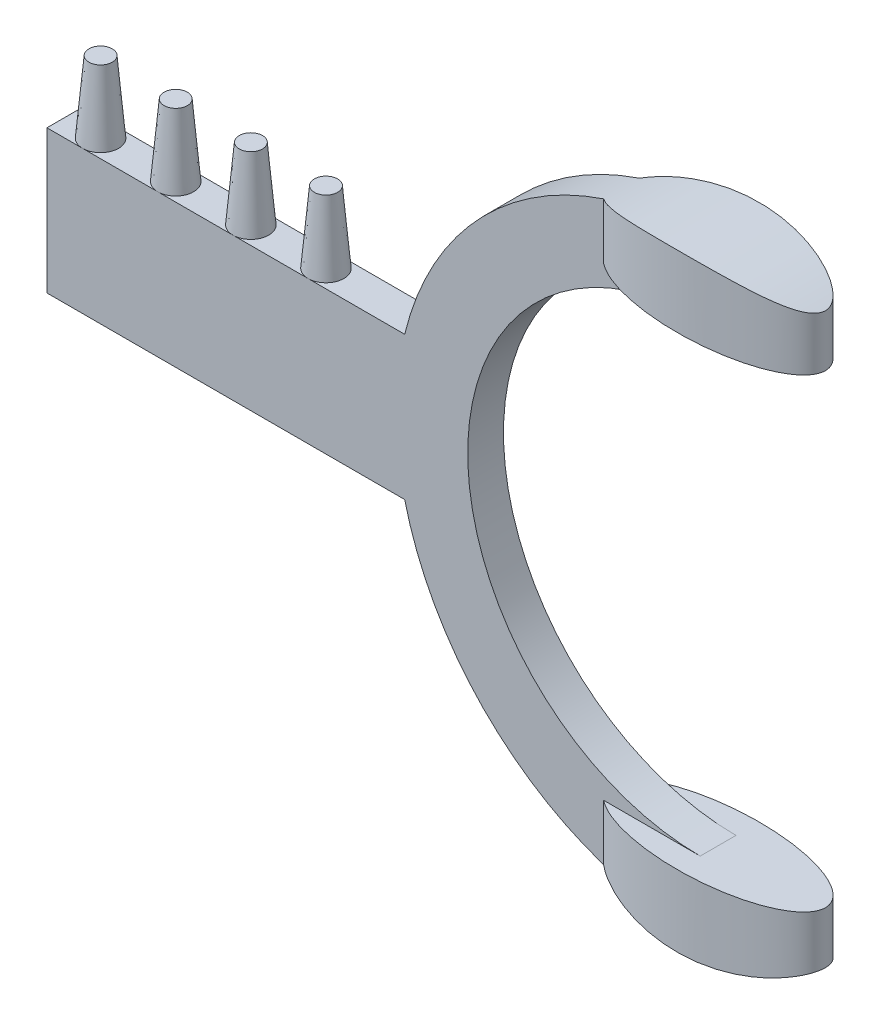
ISO-10303-21;
HEADER;
FILE_DESCRIPTION(('STEP AP214'),'2;1');
FILE_NAME('part.step','',(''),(''),'','','');
FILE_SCHEMA(('AUTOMOTIVE_DESIGN { 1 0 10303 214 1 1 1 1 }'));
ENDSEC;
DATA;
#1=APPLICATION_CONTEXT('core data for automotive mechanical design processes');
#2=APPLICATION_PROTOCOL_DEFINITION('international standard','automotive_design',2000,#1);
#3=PRODUCT_CONTEXT('',#1,'mechanical');
#4=PRODUCT('Part','Part','',(#3));
#5=PRODUCT_RELATED_PRODUCT_CATEGORY('part','',(#4));
#6=PRODUCT_DEFINITION_FORMATION('','',#4);
#7=PRODUCT_DEFINITION_CONTEXT('part definition',#1,'design');
#8=PRODUCT_DEFINITION('design','',#6,#7);
#9=PRODUCT_DEFINITION_SHAPE('','',#8);
#10=(LENGTH_UNIT() NAMED_UNIT(*) SI_UNIT(.MILLI.,.METRE.));
#11=(NAMED_UNIT(*) PLANE_ANGLE_UNIT() SI_UNIT($,.RADIAN.));
#12=(NAMED_UNIT(*) SI_UNIT($,.STERADIAN.) SOLID_ANGLE_UNIT());
#13=UNCERTAINTY_MEASURE_WITH_UNIT(LENGTH_MEASURE(1.E-05),#10,'distance_accuracy_value','');
#14=(GEOMETRIC_REPRESENTATION_CONTEXT(3) GLOBAL_UNCERTAINTY_ASSIGNED_CONTEXT((#13)) GLOBAL_UNIT_ASSIGNED_CONTEXT((#10,
#11,#12)) REPRESENTATION_CONTEXT('',''));
#15=CARTESIAN_POINT('',(0.,0.,0.));
#16=DIRECTION('',(0.,0.,1.));
#17=DIRECTION('',(1.,0.,0.));
#18=AXIS2_PLACEMENT_3D('',#15,#16,#17);
#19=CARTESIAN_POINT('',(0.,0.,0.5));
#20=DIRECTION('',(0.,0.,1.));
#21=DIRECTION('',(1.,0.,0.));
#22=AXIS2_PLACEMENT_3D('',#19,#20,#21);
#23=PLANE('',#22);
#24=DIRECTION('',(0.,1.,0.));
#25=VECTOR('',#24,1.);
#26=CARTESIAN_POINT('',(-2.70160632746191,-8.50100000000002,0.5));
#27=LINE('',#26,#25);
#28=CARTESIAN_POINT('',(-2.70160632746191,-6.5,0.5));
#29=VERTEX_POINT('',#28);
#30=CARTESIAN_POINT('',(-2.70160632746191,-8.05923837911611,0.5));
#31=VERTEX_POINT('',#30);
#32=EDGE_CURVE('E153',#29,#31,#27,.F.);
#33=ORIENTED_EDGE('',*,*,#32,.F.);
#34=DIRECTION('',(1.,0.,0.));
#35=VECTOR('',#34,1.);
#36=CARTESIAN_POINT('',(0.,-6.5,0.5));
#37=LINE('',#36,#35);
#38=CARTESIAN_POINT('',(0.,-6.50000000000001,0.5));
#39=VERTEX_POINT('',#38);
#40=EDGE_CURVE('E154',#29,#39,#37,.T.);
#41=ORIENTED_EDGE('',*,*,#40,.T.);
#42=CARTESIAN_POINT('',(0.,0.,0.5));
#43=DIRECTION('',(0.,0.,1.));
#44=DIRECTION('',(1.,0.,0.));
#45=AXIS2_PLACEMENT_3D('',#42,#43,#44);
#46=CIRCLE('',#45,6.50000000000003);
#47=CARTESIAN_POINT('',(-5.93864479941166E-07,6.5,0.5));
#48=VERTEX_POINT('',#47);
#49=EDGE_CURVE('E333',#48,#39,#46,.T.);
#50=ORIENTED_EDGE('',*,*,#49,.F.);
#51=DIRECTION('',(-1.,0.,0.));
#52=VECTOR('',#51,1.);
#53=CARTESIAN_POINT('',(0.,6.5,0.5));
#54=LINE('',#53,#52);
#55=CARTESIAN_POINT('',(-2.70160632746191,6.5,0.5));
#56=VERTEX_POINT('',#55);
#57=EDGE_CURVE('E326',#48,#56,#54,.T.);
#58=ORIENTED_EDGE('',*,*,#57,.T.);
#59=DIRECTION('',(0.,-1.,0.));
#60=VECTOR('',#59,1.);
#61=CARTESIAN_POINT('',(-2.70160632746191,8.50100000000002,0.5));
#62=LINE('',#61,#60);
#63=CARTESIAN_POINT('',(-2.70160632746191,8.05923837911611,0.499999999999999));
#64=VERTEX_POINT('',#63);
#65=EDGE_CURVE('E195',#56,#64,#62,.F.);
#66=ORIENTED_EDGE('',*,*,#65,.T.);
#67=CARTESIAN_POINT('',(0.,0.,0.5));
#68=DIRECTION('',(0.,0.,1.));
#69=DIRECTION('',(1.,0.,0.));
#70=AXIS2_PLACEMENT_3D('',#67,#68,#69);
#71=CIRCLE('',#70,8.50000000000002);
#72=CARTESIAN_POINT('',(-8.26135582092917,2.,0.5));
#73=VERTEX_POINT('',#72);
#74=EDGE_CURVE('E334',#64,#73,#71,.T.);
#75=ORIENTED_EDGE('',*,*,#74,.T.);
#76=DIRECTION('',(-1.,0.,0.));
#77=VECTOR('',#76,1.);
#78=CARTESIAN_POINT('',(0.,2.,0.5));
#79=LINE('',#78,#77);
#80=CARTESIAN_POINT('',(-10.9613558209292,2.,0.5));
#81=VERTEX_POINT('',#80);
#82=EDGE_CURVE('E336',#73,#81,#79,.T.);
#83=ORIENTED_EDGE('',*,*,#82,.T.);
#84=CARTESIAN_POINT('',(-13.0613558209292,2.,0.5));
#85=VERTEX_POINT('',#84);
#86=EDGE_CURVE('E338',#81,#85,#79,.T.);
#87=ORIENTED_EDGE('',*,*,#86,.T.);
#88=CARTESIAN_POINT('',(-15.1613558209292,2.,0.5));
#89=VERTEX_POINT('',#88);
#90=EDGE_CURVE('E310',#85,#89,#79,.T.);
#91=ORIENTED_EDGE('',*,*,#90,.T.);
#92=CARTESIAN_POINT('',(-17.2613558209292,2.,0.5));
#93=VERTEX_POINT('',#92);
#94=EDGE_CURVE('E341',#89,#93,#79,.T.);
#95=ORIENTED_EDGE('',*,*,#94,.T.);
#96=CARTESIAN_POINT('',(-18.2613558209292,2.,0.5));
#97=VERTEX_POINT('',#96);
#98=EDGE_CURVE('E339',#93,#97,#79,.T.);
#99=ORIENTED_EDGE('',*,*,#98,.T.);
#100=DIRECTION('',(0.,-1.,0.));
#101=VECTOR('',#100,1.);
#102=CARTESIAN_POINT('',(-18.2613558209292,0.,0.5));
#103=LINE('',#102,#101);
#104=CARTESIAN_POINT('',(-18.2613558209292,-2.,0.5));
#105=VERTEX_POINT('',#104);
#106=EDGE_CURVE('E263',#97,#105,#103,.T.);
#107=ORIENTED_EDGE('',*,*,#106,.T.);
#108=DIRECTION('',(-1.,0.,0.));
#109=VECTOR('',#108,1.);
#110=CARTESIAN_POINT('',(0.,-2.,0.5));
#111=LINE('',#110,#109);
#112=CARTESIAN_POINT('',(-8.26135582092917,-2.,0.5));
#113=VERTEX_POINT('',#112);
#114=EDGE_CURVE('E249',#113,#105,#111,.T.);
#115=ORIENTED_EDGE('',*,*,#114,.F.);
#116=EDGE_CURVE('E330',#113,#31,#71,.T.);
#117=ORIENTED_EDGE('',*,*,#116,.T.);
#118=EDGE_LOOP('',(#33,#41,#50,#58,#66,#75,#83,#87,#91,#95,#99,#107,#115,#117));
#119=FACE_BOUND('',#118,.T.);
#120=ADVANCED_FACE('F41',(#119),#23,.T.);
#121=CARTESIAN_POINT('',(0.,0.,-0.5));
#122=DIRECTION('',(0.,0.,1.));
#123=DIRECTION('',(1.,0.,0.));
#124=AXIS2_PLACEMENT_3D('',#121,#122,#123);
#125=PLANE('',#124);
#126=DIRECTION('',(1.,0.,0.));
#127=VECTOR('',#126,1.);
#128=CARTESIAN_POINT('',(0.,-6.5,-0.5));
#129=LINE('',#128,#127);
#130=CARTESIAN_POINT('',(-2.70160632746191,-6.5,-0.5));
#131=VERTEX_POINT('',#130);
#132=CARTESIAN_POINT('',(-5.93864479941166E-07,-6.5,-0.5));
#133=VERTEX_POINT('',#132);
#134=EDGE_CURVE('E158',#131,#133,#129,.T.);
#135=ORIENTED_EDGE('',*,*,#134,.F.);
#136=DIRECTION('',(0.,1.,0.));
#137=VECTOR('',#136,1.);
#138=CARTESIAN_POINT('',(-2.70160632746191,-8.50100000000002,-0.5));
#139=LINE('',#138,#137);
#140=CARTESIAN_POINT('',(-2.70160632746191,-8.05923837911611,-0.5));
#141=VERTEX_POINT('',#140);
#142=EDGE_CURVE('E142',#131,#141,#139,.F.);
#143=ORIENTED_EDGE('',*,*,#142,.T.);
#144=CARTESIAN_POINT('',(0.,0.,-0.5));
#145=DIRECTION('',(0.,0.,1.));
#146=DIRECTION('',(1.,0.,0.));
#147=AXIS2_PLACEMENT_3D('',#144,#145,#146);
#148=CIRCLE('',#147,8.50000000000002);
#149=CARTESIAN_POINT('',(-8.26135582092917,-2.,-0.5));
#150=VERTEX_POINT('',#149);
#151=EDGE_CURVE('E254',#150,#141,#148,.T.);
#152=ORIENTED_EDGE('',*,*,#151,.F.);
#153=DIRECTION('',(-1.,0.,0.));
#154=VECTOR('',#153,1.);
#155=CARTESIAN_POINT('',(0.,-2.,-0.5));
#156=LINE('',#155,#154);
#157=CARTESIAN_POINT('',(-18.2613558209292,-2.,-0.5));
#158=VERTEX_POINT('',#157);
#159=EDGE_CURVE('E253',#150,#158,#156,.T.);
#160=ORIENTED_EDGE('',*,*,#159,.T.);
#161=DIRECTION('',(0.,-1.,0.));
#162=VECTOR('',#161,1.);
#163=CARTESIAN_POINT('',(-18.2613558209292,0.,-0.5));
#164=LINE('',#163,#162);
#165=CARTESIAN_POINT('',(-18.2613558209292,2.,-0.5));
#166=VERTEX_POINT('',#165);
#167=EDGE_CURVE('E241',#166,#158,#164,.T.);
#168=ORIENTED_EDGE('',*,*,#167,.F.);
#169=DIRECTION('',(-1.,0.,0.));
#170=VECTOR('',#169,1.);
#171=CARTESIAN_POINT('',(0.,2.,-0.5));
#172=LINE('',#171,#170);
#173=CARTESIAN_POINT('',(-17.2613558209292,2.,-0.5));
#174=VERTEX_POINT('',#173);
#175=EDGE_CURVE('E268',#174,#166,#172,.T.);
#176=ORIENTED_EDGE('',*,*,#175,.F.);
#177=CARTESIAN_POINT('',(-15.1613558209292,2.,-0.5));
#178=VERTEX_POINT('',#177);
#179=EDGE_CURVE('E288',#178,#174,#172,.T.);
#180=ORIENTED_EDGE('',*,*,#179,.F.);
#181=CARTESIAN_POINT('',(-13.0613558209292,2.,-0.5));
#182=VERTEX_POINT('',#181);
#183=EDGE_CURVE('E291',#182,#178,#172,.T.);
#184=ORIENTED_EDGE('',*,*,#183,.F.);
#185=CARTESIAN_POINT('',(-10.9613558209292,2.,-0.5));
#186=VERTEX_POINT('',#185);
#187=EDGE_CURVE('E267',#186,#182,#172,.T.);
#188=ORIENTED_EDGE('',*,*,#187,.F.);
#189=CARTESIAN_POINT('',(-8.26135582092917,2.,-0.5));
#190=VERTEX_POINT('',#189);
#191=EDGE_CURVE('E250',#190,#186,#172,.T.);
#192=ORIENTED_EDGE('',*,*,#191,.F.);
#193=CARTESIAN_POINT('',(-2.70160632746196,8.0592383791161,-0.5));
#194=VERTEX_POINT('',#193);
#195=EDGE_CURVE('E259',#194,#190,#148,.T.);
#196=ORIENTED_EDGE('',*,*,#195,.F.);
#197=DIRECTION('',(0.,-1.,0.));
#198=VECTOR('',#197,1.);
#199=CARTESIAN_POINT('',(-2.70160632746191,8.50100000000002,-0.5));
#200=LINE('',#199,#198);
#201=CARTESIAN_POINT('',(-2.70160632746191,6.5,-0.5));
#202=VERTEX_POINT('',#201);
#203=EDGE_CURVE('E49',#202,#194,#200,.F.);
#204=ORIENTED_EDGE('',*,*,#203,.F.);
#205=DIRECTION('',(-1.,0.,0.));
#206=VECTOR('',#205,1.);
#207=CARTESIAN_POINT('',(0.,6.5,-0.5));
#208=LINE('',#207,#206);
#209=CARTESIAN_POINT('',(-5.93864479941166E-07,6.5,-0.5));
#210=VERTEX_POINT('',#209);
#211=EDGE_CURVE('E11',#210,#202,#208,.T.);
#212=ORIENTED_EDGE('',*,*,#211,.F.);
#213=CARTESIAN_POINT('',(0.,0.,-0.5));
#214=DIRECTION('',(0.,0.,1.));
#215=DIRECTION('',(1.,0.,0.));
#216=AXIS2_PLACEMENT_3D('',#213,#214,#215);
#217=CIRCLE('',#216,6.50000000000003);
#218=EDGE_CURVE('E166',#210,#133,#217,.T.);
#219=ORIENTED_EDGE('',*,*,#218,.T.);
#220=EDGE_LOOP('',(#135,#143,#152,#160,#168,#176,#180,#184,#188,#192,#196,#204,#212,#219));
#221=FACE_BOUND('',#220,.T.);
#222=ADVANCED_FACE('F163',(#221),#125,.F.);
#223=CARTESIAN_POINT('',(0.,2.,0.5));
#224=DIRECTION('',(0.,-1.,0.));
#225=DIRECTION('',(1.,0.,0.));
#226=AXIS2_PLACEMENT_3D('',#223,#224,#225);
#227=PLANE('',#226);
#228=CARTESIAN_POINT('',(-17.2613558209292,2.,0.));
#229=DIRECTION('',(0.,1.,0.));
#230=DIRECTION('',(-1.,0.,0.));
#231=AXIS2_PLACEMENT_3D('',#228,#229,#230);
#232=CIRCLE('',#231,0.499999999999999);
#233=EDGE_CURVE('E351',#174,#93,#232,.T.);
#234=ORIENTED_EDGE('',*,*,#233,.F.);
#235=ORIENTED_EDGE('',*,*,#175,.T.);
#236=DIRECTION('',(0.,0.,-1.));
#237=VECTOR('',#236,1.);
#238=CARTESIAN_POINT('',(-18.2613558209292,2.,0.5));
#239=LINE('',#238,#237);
#240=EDGE_CURVE('E247',#97,#166,#239,.T.);
#241=ORIENTED_EDGE('',*,*,#240,.F.);
#242=ORIENTED_EDGE('',*,*,#98,.F.);
#243=EDGE_LOOP('',(#234,#235,#241,#242));
#244=FACE_BOUND('',#243,.T.);
#245=ADVANCED_FACE('F219',(#244),#227,.F.);
#246=EDGE_CURVE('E64',#93,#174,#232,.T.);
#247=ORIENTED_EDGE('',*,*,#246,.F.);
#248=ORIENTED_EDGE('',*,*,#94,.F.);
#249=CARTESIAN_POINT('',(-15.1613558209292,2.,0.));
#250=DIRECTION('',(0.,1.,0.));
#251=DIRECTION('',(-1.,0.,0.));
#252=AXIS2_PLACEMENT_3D('',#249,#250,#251);
#253=CIRCLE('',#252,0.499999999999999);
#254=EDGE_CURVE('E318',#178,#89,#253,.T.);
#255=ORIENTED_EDGE('',*,*,#254,.F.);
#256=ORIENTED_EDGE('',*,*,#179,.T.);
#257=EDGE_LOOP('',(#247,#248,#255,#256));
#258=FACE_BOUND('',#257,.T.);
#259=ADVANCED_FACE('F364',(#258),#227,.F.);
#260=EDGE_CURVE('E350',#89,#178,#253,.T.);
#261=ORIENTED_EDGE('',*,*,#260,.F.);
#262=ORIENTED_EDGE('',*,*,#90,.F.);
#263=CARTESIAN_POINT('',(-13.0613558209292,2.,0.));
#264=DIRECTION('',(0.,1.,0.));
#265=DIRECTION('',(-1.,0.,0.));
#266=AXIS2_PLACEMENT_3D('',#263,#264,#265);
#267=CIRCLE('',#266,0.499999999999999);
#268=EDGE_CURVE('E307',#182,#85,#267,.T.);
#269=ORIENTED_EDGE('',*,*,#268,.F.);
#270=ORIENTED_EDGE('',*,*,#183,.T.);
#271=EDGE_LOOP('',(#261,#262,#269,#270));
#272=FACE_BOUND('',#271,.T.);
#273=ADVANCED_FACE('F308',(#272),#227,.F.);
#274=EDGE_CURVE('E301',#85,#182,#267,.T.);
#275=ORIENTED_EDGE('',*,*,#274,.F.);
#276=ORIENTED_EDGE('',*,*,#86,.F.);
#277=CARTESIAN_POINT('',(-10.9613558209292,2.,0.));
#278=DIRECTION('',(0.,1.,0.));
#279=DIRECTION('',(-1.,0.,0.));
#280=AXIS2_PLACEMENT_3D('',#277,#278,#279);
#281=CIRCLE('',#280,0.499999999999999);
#282=EDGE_CURVE('E304',#186,#81,#281,.T.);
#283=ORIENTED_EDGE('',*,*,#282,.F.);
#284=ORIENTED_EDGE('',*,*,#187,.T.);
#285=EDGE_LOOP('',(#275,#276,#283,#284));
#286=FACE_BOUND('',#285,.T.);
#287=ADVANCED_FACE('F236',(#286),#227,.F.);
#288=CARTESIAN_POINT('',(0.,-2.,0.5));
#289=DIRECTION('',(0.,-1.,0.));
#290=DIRECTION('',(1.,0.,0.));
#291=AXIS2_PLACEMENT_3D('',#288,#289,#290);
#292=PLANE('',#291);
#293=ORIENTED_EDGE('',*,*,#159,.F.);
#294=DIRECTION('',(0.,0.,-1.));
#295=VECTOR('',#294,1.);
#296=CARTESIAN_POINT('',(-8.26135582092917,-2.,0.5));
#297=LINE('',#296,#295);
#298=EDGE_CURVE('E279',#113,#150,#297,.T.);
#299=ORIENTED_EDGE('',*,*,#298,.F.);
#300=ORIENTED_EDGE('',*,*,#114,.T.);
#301=DIRECTION('',(0.,0.,-1.));
#302=VECTOR('',#301,1.);
#303=CARTESIAN_POINT('',(-18.2613558209292,-2.,0.5));
#304=LINE('',#303,#302);
#305=EDGE_CURVE('E244',#105,#158,#304,.T.);
#306=ORIENTED_EDGE('',*,*,#305,.T.);
#307=EDGE_LOOP('',(#293,#299,#300,#306));
#308=FACE_BOUND('',#307,.T.);
#309=ADVANCED_FACE('F43',(#308),#292,.T.);
#310=CARTESIAN_POINT('',(0.,0.,0.5));
#311=DIRECTION('',(0.,0.,-1.));
#312=DIRECTION('',(-1.,0.,0.));
#313=AXIS2_PLACEMENT_3D('',#310,#311,#312);
#314=CYLINDRICAL_SURFACE('',#313,8.50000000000002);
#315=CARTESIAN_POINT('',(3.,-7.95298686029346,0.));
#316=CARTESIAN_POINT('',(2.9999959108719,-7.95298855295776,0.0260147271016425));
#317=CARTESIAN_POINT('',(2.99766665927485,-7.95386822399586,0.0520591863626919));
#318=CARTESIAN_POINT('',(2.98863389372765,-7.95726642069293,0.103276359793234));
#319=CARTESIAN_POINT('',(2.98192134678276,-7.95978833061035,0.128447160488879));
#320=CARTESIAN_POINT('',(2.96266800351684,-7.96697724763944,0.183474465299373));
#321=CARTESIAN_POINT('',(2.94908386796738,-7.97202498742494,0.212910388801911));
#322=CARTESIAN_POINT('',(2.91767885254025,-7.98357262558042,0.269099124002897));
#323=CARTESIAN_POINT('',(2.89984852498349,-7.99007576019836,0.29584576062084));
#324=CARTESIAN_POINT('',(2.84758712408276,-8.00889853104734,0.364712839687107));
#325=CARTESIAN_POINT('',(2.8103058690957,-8.0220900259063,0.404401041369452));
#326=CARTESIAN_POINT('',(2.73072498296844,-8.04953021621946,0.477846853774185));
#327=CARTESIAN_POINT('',(2.6884128669448,-8.06378150749573,0.51158917174944));
#328=CARTESIAN_POINT('',(2.59738346151732,-8.09358116091549,0.576726508062965));
#329=CARTESIAN_POINT('',(2.54842406623227,-8.10914823114291,0.607770054965902));
#330=CARTESIAN_POINT('',(2.44810864371719,-8.13999515750652,0.665604250227784));
#331=CARTESIAN_POINT('',(2.39675580763246,-8.1552753600069,0.692400362959232));
#332=CARTESIAN_POINT('',(2.29238765868686,-8.18522443558582,0.742512806164404));
#333=CARTESIAN_POINT('',(2.23937674549075,-8.19989471984251,0.765837533353423));
#334=CARTESIAN_POINT('',(2.13197674909596,-8.2284730819204,0.809623695138372));
#335=CARTESIAN_POINT('',(2.07758720795967,-8.24238090149105,0.830084163196453));
#336=CARTESIAN_POINT('',(1.91257966725466,-8.28280489803793,0.88784118917448));
#337=CARTESIAN_POINT('',(1.80031899568042,-8.30796484805419,0.921423488159332));
#338=CARTESIAN_POINT('',(1.57286925838835,-8.35401585768165,0.980682572632021));
#339=CARTESIAN_POINT('',(1.45767855796602,-8.37490447279171,1.00635483541167));
#340=CARTESIAN_POINT('',(1.22547992226453,-8.41201485827348,1.05085129924504));
#341=CARTESIAN_POINT('',(1.1084758063482,-8.42824531998399,1.06968827141045));
#342=CARTESIAN_POINT('',(0.873081007424137,-8.45587244183487,1.10125915623323));
#343=CARTESIAN_POINT('',(0.754690192337219,-8.46726863761387,1.11399248261263));
#344=CARTESIAN_POINT('',(0.517118497299144,-8.48509115857603,1.13374365682674));
#345=CARTESIAN_POINT('',(0.397937996178251,-8.49151971416982,1.14076406976603));
#346=CARTESIAN_POINT('',(0.159211346722875,-8.49934796849401,1.1492984147317));
#347=CARTESIAN_POINT('',(0.0396651813171031,-8.50074742873739,1.1508120856204));
#348=CARTESIAN_POINT('',(-0.199323831228418,-8.49850282283286,1.14837347803895));
#349=CARTESIAN_POINT('',(-0.318766678782181,-8.4948587769898,1.14442122157428));
#350=CARTESIAN_POINT('',(-0.557076128098612,-8.48256444851291,1.1309422274516));
#351=CARTESIAN_POINT('',(-0.675942759482292,-8.47391442602859,1.12141577947168));
#352=CARTESIAN_POINT('',(-0.912650175402699,-8.45169848725537,1.09650373167981));
#353=CARTESIAN_POINT('',(-1.03049052401184,-8.43813057723806,1.0811157554553));
#354=CARTESIAN_POINT('',(-1.26453088272762,-8.40624168009456,1.04397847745258));
#355=CARTESIAN_POINT('',(-1.380730973019,-8.3879209261676,1.0222294877721));
#356=CARTESIAN_POINT('',(-1.57271282266436,-8.35360389448794,0.97989790126509));
#357=CARTESIAN_POINT('',(-1.64915871040695,-8.33884097872818,0.961306027270575));
#358=CARTESIAN_POINT('',(-1.80064793179029,-8.30744491757207,0.920498901654147));
#359=CARTESIAN_POINT('',(-1.87569213351089,-8.29081297771452,0.898285981522418));
#360=CARTESIAN_POINT('',(-2.00851501954454,-8.25950987317198,0.854740343002348));
#361=CARTESIAN_POINT('',(-2.06662580640379,-8.24515483445829,0.834192982133669));
#362=CARTESIAN_POINT('',(-2.18153980618405,-8.21549791453905,0.790031967344711));
#363=CARTESIAN_POINT('',(-2.23834106074984,-8.20019472735093,0.766414032547628));
#364=CARTESIAN_POINT('',(-2.33169973497486,-8.17402555743258,0.723937041766341));
#365=CARTESIAN_POINT('',(-2.36876492680198,-8.16335755554399,0.706071401770613));
#366=CARTESIAN_POINT('',(-2.4418661079014,-8.14178976206545,0.668478177520031));
#367=CARTESIAN_POINT('',(-2.47790232774201,-8.13089002337251,0.648751014721567));
#368=CARTESIAN_POINT('',(-2.54861748569367,-8.10900217362041,0.607161462595867));
#369=CARTESIAN_POINT('',(-2.58329855921864,-8.09801423744886,0.585302639454364));
#370=CARTESIAN_POINT('',(-2.65093038444026,-8.0761270804461,0.539037445187645));
#371=CARTESIAN_POINT('',(-2.68388240671374,-8.06522779958885,0.514632985249034));
#372=CARTESIAN_POINT('',(-2.74518650974439,-8.04455855190317,0.464574593345967));
#373=CARTESIAN_POINT('',(-2.77369910632613,-8.03476314289795,0.439130072031093));
#374=CARTESIAN_POINT('',(-2.82785433267007,-8.01586298413933,0.385045426427976));
#375=CARTESIAN_POINT('',(-2.85349689575087,-8.00675825043443,0.356405227923274));
#376=CARTESIAN_POINT('',(-2.89667560550044,-7.9912270043389,0.30039376633901));
#377=CARTESIAN_POINT('',(-2.91485174100271,-7.98460591295523,0.273578472126971));
#378=CARTESIAN_POINT('',(-2.94695499243157,-7.97281310822338,0.217211262134956));
#379=CARTESIAN_POINT('',(-2.96089199541493,-7.9676380246393,0.187665927042192));
#380=CARTESIAN_POINT('',(-2.98011817260646,-7.9604631349923,0.134160539130647));
#381=CARTESIAN_POINT('',(-2.98671269521815,-7.95798791953935,0.110739032335958));
#382=CARTESIAN_POINT('',(-2.9961351055695,-7.95444533847272,0.0630476702009436));
#383=CARTESIAN_POINT('',(-2.9989670320492,-7.95337646331683,0.0387787532379952));
#384=CARTESIAN_POINT('',(-3.00056269835907,-7.95277464295626,-0.00998270828054108));
#385=CARTESIAN_POINT('',(-2.99931525334934,-7.9532459205473,-0.0344756837456972));
#386=CARTESIAN_POINT('',(-2.99287178854804,-7.9556727873225,-0.0828609357561755));
#387=CARTESIAN_POINT('',(-2.98767259643441,-7.95762956901502,-0.10675271375436));
#388=CARTESIAN_POINT('',(-2.9721198039444,-7.96345322220029,-0.159134018462358));
#389=CARTESIAN_POINT('',(-2.96080817444649,-7.96767326621862,-0.187295733795234));
#390=CARTESIAN_POINT('',(-2.93408519735629,-7.9775527320794,-0.24132377607719));
#391=CARTESIAN_POINT('',(-2.91866446989837,-7.98321544579857,-0.267184668455172));
#392=CARTESIAN_POINT('',(-2.87394503718559,-7.99945641859493,-0.332526998128874));
#393=CARTESIAN_POINT('',(-2.8421076382682,-8.01085048878302,-0.370044124039901));
#394=CARTESIAN_POINT('',(-2.77360186598674,-8.03482827010876,-0.439851926104875));
#395=CARTESIAN_POINT('',(-2.73692163569632,-8.0474148789168,-0.472129326596877));
#396=CARTESIAN_POINT('',(-2.65892085033611,-8.07353070234178,-0.533702172204936));
#397=CARTESIAN_POINT('',(-2.61747351918105,-8.08707748811221,-0.562827178601635));
#398=CARTESIAN_POINT('',(-2.53224435967802,-8.11416955631942,-0.617466409098007));
#399=CARTESIAN_POINT('',(-2.48846019702668,-8.12771482317741,-0.64297692603449));
#400=CARTESIAN_POINT('',(-2.36787123813673,-8.16391184038257,-0.707914541020755));
#401=CARTESIAN_POINT('',(-2.28947231040845,-8.18627792616878,-0.744532203815086));
#402=CARTESIAN_POINT('',(-2.12949448211042,-8.22934672084716,-0.811287997079933));
#403=CARTESIAN_POINT('',(-2.04791202319188,-8.25004748438241,-0.841418616582987));
#404=CARTESIAN_POINT('',(-1.88279835105631,-8.28928491000016,-0.896291726967874));
#405=CARTESIAN_POINT('',(-1.79927504488205,-8.30782896248008,-0.92105288574978));
#406=CARTESIAN_POINT('',(-1.63054537535578,-8.34258640437874,-0.966112799405942));
#407=CARTESIAN_POINT('',(-1.54533854782088,-8.35879914050891,-0.986410304301697));
#408=CARTESIAN_POINT('',(-1.37373261826467,-8.38870883938625,-1.02303983150773));
#409=CARTESIAN_POINT('',(-1.28733473519328,-8.40240819470899,-1.03937562992492));
#410=CARTESIAN_POINT('',(-1.11356131249972,-8.42719958952643,-1.06845924715157));
#411=CARTESIAN_POINT('',(-1.02618559550734,-8.43829114768847,-1.08120640367505));
#412=CARTESIAN_POINT('',(-0.763052183326261,-8.46751743828601,-1.11443458855574));
#413=CARTESIAN_POINT('',(-0.586179680071401,-8.48162282100419,-1.12992466134519));
#414=CARTESIAN_POINT('',(-0.231310935405776,-8.49871018780484,-1.14862715176605));
#415=CARTESIAN_POINT('',(-0.0533147755742502,-8.5016929703103,-1.15184045067187));
#416=CARTESIAN_POINT('',(0.302324344066095,-8.49648323288301,-1.14617795597386));
#417=CARTESIAN_POINT('',(0.479967302214633,-8.48829066054249,-1.13730210567694));
#418=CARTESIAN_POINT('',(0.833391122595574,-8.46090075504669,-1.10692025598794));
#419=CARTESIAN_POINT('',(1.00917182569398,-8.44170248903256,-1.08541318595124));
#420=CARTESIAN_POINT('',(1.26998077119296,-8.40505122273797,-1.04250133175851));
#421=CARTESIAN_POINT('',(1.35647102783929,-8.39151879903284,-1.02641437544597));
#422=CARTESIAN_POINT('',(1.52819049961193,-8.36195033058439,-0.990324400089918));
#423=CARTESIAN_POINT('',(1.61342001157222,-8.34591488577276,-0.970322319144321));
#424=CARTESIAN_POINT('',(1.78237344453668,-8.31147346976591,-0.925864090193641));
#425=CARTESIAN_POINT('',(1.86609486138949,-8.29306390777884,-0.901401171594487));
#426=CARTESIAN_POINT('',(2.03129369117721,-8.25415224776334,-0.847303246654558));
#427=CARTESIAN_POINT('',(2.11277321409844,-8.23365220916665,-0.817673310544345));
#428=CARTESIAN_POINT('',(2.23821953518478,-8.20015826210349,-0.766168010339397));
#429=CARTESIAN_POINT('',(2.2832249537524,-8.1877353453391,-0.746451058156557));
#430=CARTESIAN_POINT('',(2.37205005017868,-8.16244552986437,-0.704576484196318));
#431=CARTESIAN_POINT('',(2.41586770348552,-8.14957794889347,-0.682414986102386));
#432=CARTESIAN_POINT('',(2.51914418277755,-8.1183649977287,-0.625791764494423));
#433=CARTESIAN_POINT('',(2.57784300808728,-8.09988872552563,-0.589957370070399));
#434=CARTESIAN_POINT('',(2.66204477021691,-8.07244671644158,-0.530734628451135));
#435=CARTESIAN_POINT('',(2.68944702449577,-8.06335318746398,-0.510103777563253));
#436=CARTESIAN_POINT('',(2.74257430708185,-8.04543771256613,-0.466692758293482));
#437=CARTESIAN_POINT('',(2.76830065080139,-8.0366155565891,-0.443914310772101));
#438=CARTESIAN_POINT('',(2.81634702742988,-8.01990062138383,-0.396951644209587));
#439=CARTESIAN_POINT('',(2.83877006172482,-8.01198367695438,-0.372882868293607));
#440=CARTESIAN_POINT('',(2.8807947958359,-7.99696937561317,-0.322059110812738));
#441=CARTESIAN_POINT('',(2.90039292717796,-7.98987305753097,-0.295300802919903));
#442=CARTESIAN_POINT('',(2.93582766985626,-7.97692152433498,-0.238418546976955));
#443=CARTESIAN_POINT('',(2.95159742282374,-7.97108853791225,-0.208246656796854));
#444=CARTESIAN_POINT('',(2.97713906460635,-7.96158492241749,-0.145186839033873));
#445=CARTESIAN_POINT('',(2.98694310920795,-7.95790270486987,-0.112314576500914));
#446=CARTESIAN_POINT('',(2.9952873469521,-7.95476326678509,-0.0657502764465494));
#447=CARTESIAN_POINT('',(2.99704736795764,-7.95410011431997,-0.0526767842365379));
#448=CARTESIAN_POINT('',(2.99940495159192,-7.95321139892433,-0.0264047788778011));
#449=CARTESIAN_POINT('',(3.0000020758214,-7.95298600102255,-0.0132062204639724));
#450=CARTESIAN_POINT('',(3.,-7.95298686029346,0.));
#451=B_SPLINE_CURVE_WITH_KNOTS('',3,(#315,#316,#317,#318,#319,#320,#321,#322,#323,#324,#325,
#326,#327,#328,#329,#330,#331,#332,#333,#334,#335,#336,#337,#338,#339,#340,#341,#342,#343,#344,
#345,#346,#347,#348,#349,#350,#351,#352,#353,#354,#355,#356,#357,#358,#359,#360,#361,#362,#363,
#364,#365,#366,#367,#368,#369,#370,#371,#372,#373,#374,#375,#376,#377,#378,#379,#380,#381,#382,
#383,#384,#385,#386,#387,#388,#389,#390,#391,#392,#393,#394,#395,#396,#397,#398,#399,#400,#401,
#402,#403,#404,#405,#406,#407,#408,#409,#410,#411,#412,#413,#414,#415,#416,#417,#418,#419,#420,
#421,#422,#423,#424,#425,#426,#427,#428,#429,#430,#431,#432,#433,#434,#435,#436,#437,#438,#439,
#440,#441,#442,#443,#444,#445,#446,#447,#448,#449,#450),.UNSPECIFIED.,.T.,.F.,(4,2,2,2,2,2,2,2,
2,2,2,2,2,2,2,2,2,2,2,2,2,2,2,2,2,2,2,2,2,2,2,2,2,2,2,2,2,2,2,2,2,2,2,2,2,2,2,2,2,2,2,2,2,2,2,2,
2,2,2,2,2,2,2,2,2,2,2,4),(0.,0.0779851312791418,0.156131481877094,0.253999312788532,
0.352086966020991,0.519225417759935,0.686787665065717,0.86658899853748,1.04615710447761,
1.22528354741404,1.40447029120995,1.76351036805804,2.12275535332354,2.48132562357198,
2.839930328935,3.19837393140133,3.55683453156067,3.91529368858354,4.27373421895066,
4.63232022515897,4.99088864060053,5.23093477539195,5.47082695728264,5.66060916428872,
5.85065885404846,5.97813536433649,6.10558308235158,6.2328211282544,6.35996432603002,
6.47814320722132,6.59632483357237,6.69521557352222,6.79387386706627,6.86694717670745,
6.93994198651415,7.0131371014546,7.08639103697112,7.17779793184573,7.26941529636648,
7.42008306662328,7.57112681210085,7.72819918017968,7.88543149945222,8.15309251064575,
8.42106178376138,8.68808392093313,8.95518073864951,9.2220219631091,9.48891240103891,
10.0223574284627,10.5557641624152,11.0891733978324,11.6226278524909,11.8895494625893,
12.1564071940674,12.423673381551,12.6906787699667,12.8426567049961,12.9948791932365,
13.2080349135217,13.3144132741924,13.4207071072646,13.5220335201451,13.6234868294406,
13.7266016307507,13.8291555921511,13.8687293611623,13.9083180461621),.UNSPECIFIED.);
#452=EDGE_CURVE('E148',#141,#31,#451,.T.);
#453=ORIENTED_EDGE('',*,*,#452,.T.);
#454=ORIENTED_EDGE('',*,*,#116,.F.);
#455=ORIENTED_EDGE('',*,*,#298,.T.);
#456=ORIENTED_EDGE('',*,*,#151,.T.);
#457=EDGE_LOOP('',(#453,#454,#455,#456));
#458=FACE_BOUND('',#457,.T.);
#459=ADVANCED_FACE('F203',(#458),#314,.T.);
#460=CARTESIAN_POINT('',(0.,0.,0.5));
#461=DIRECTION('',(0.,0.,-1.));
#462=DIRECTION('',(-1.,0.,0.));
#463=AXIS2_PLACEMENT_3D('',#460,#461,#462);
#464=CYLINDRICAL_SURFACE('',#463,6.50000000000003);
#465=ORIENTED_EDGE('',*,*,#218,.F.);
#466=DIRECTION('',(0.,0.,-1.));
#467=VECTOR('',#466,1.);
#468=CARTESIAN_POINT('',(-5.93864479941166E-07,6.5,0.5));
#469=LINE('',#468,#467);
#470=EDGE_CURVE('E275',#48,#210,#469,.T.);
#471=ORIENTED_EDGE('',*,*,#470,.F.);
#472=ORIENTED_EDGE('',*,*,#49,.T.);
#473=DIRECTION('',(0.,0.,-1.));
#474=VECTOR('',#473,1.);
#475=CARTESIAN_POINT('',(-5.93864479941166E-07,-6.5,0.5));
#476=LINE('',#475,#474);
#477=EDGE_CURVE('E277',#39,#133,#476,.T.);
#478=ORIENTED_EDGE('',*,*,#477,.T.);
#479=EDGE_LOOP('',(#465,#471,#472,#478));
#480=FACE_BOUND('',#479,.T.);
#481=ADVANCED_FACE('F202',(#480),#464,.F.);
#482=CARTESIAN_POINT('',(3.,7.95298686029346,0.));
#483=CARTESIAN_POINT('',(2.9999959108719,7.95298855295776,0.0260147271016425));
#484=CARTESIAN_POINT('',(2.99766665927485,7.95386822399586,0.0520591863626919));
#485=CARTESIAN_POINT('',(2.98863389372765,7.95726642069293,0.103276359793234));
#486=CARTESIAN_POINT('',(2.98192134678276,7.95978833061035,0.128447160488879));
#487=CARTESIAN_POINT('',(2.96266800351684,7.96697724763944,0.183474465299373));
#488=CARTESIAN_POINT('',(2.94908386796738,7.97202498742494,0.212910388801911));
#489=CARTESIAN_POINT('',(2.91767885254025,7.98357262558042,0.269099124002897));
#490=CARTESIAN_POINT('',(2.89984852498349,7.99007576019836,0.29584576062084));
#491=CARTESIAN_POINT('',(2.84758712408276,8.00889853104734,0.364712839687107));
#492=CARTESIAN_POINT('',(2.8103058690957,8.0220900259063,0.404401041369452));
#493=CARTESIAN_POINT('',(2.73072498296844,8.04953021621946,0.477846853774185));
#494=CARTESIAN_POINT('',(2.6884128669448,8.06378150749573,0.51158917174944));
#495=CARTESIAN_POINT('',(2.59738346151732,8.09358116091549,0.576726508062965));
#496=CARTESIAN_POINT('',(2.54842406623227,8.10914823114291,0.607770054965902));
#497=CARTESIAN_POINT('',(2.44810864371719,8.13999515750652,0.665604250227784));
#498=CARTESIAN_POINT('',(2.39675580763246,8.1552753600069,0.692400362959232));
#499=CARTESIAN_POINT('',(2.29238765868686,8.18522443558582,0.742512806164404));
#500=CARTESIAN_POINT('',(2.23937674549075,8.19989471984251,0.765837533353423));
#501=CARTESIAN_POINT('',(2.13197674909596,8.2284730819204,0.809623695138372));
#502=CARTESIAN_POINT('',(2.07758720795967,8.24238090149105,0.830084163196453));
#503=CARTESIAN_POINT('',(1.91257966725466,8.28280489803793,0.88784118917448));
#504=CARTESIAN_POINT('',(1.80031899568042,8.30796484805419,0.921423488159332));
#505=CARTESIAN_POINT('',(1.57286925838835,8.35401585768165,0.980682572632021));
#506=CARTESIAN_POINT('',(1.45767855796602,8.37490447279171,1.00635483541167));
#507=CARTESIAN_POINT('',(1.22547992226453,8.41201485827348,1.05085129924504));
#508=CARTESIAN_POINT('',(1.1084758063482,8.42824531998399,1.06968827141045));
#509=CARTESIAN_POINT('',(0.873081007424137,8.45587244183487,1.10125915623323));
#510=CARTESIAN_POINT('',(0.754690192337219,8.46726863761387,1.11399248261263));
#511=CARTESIAN_POINT('',(0.517118497299144,8.48509115857603,1.13374365682674));
#512=CARTESIAN_POINT('',(0.397937996178251,8.49151971416982,1.14076406976603));
#513=CARTESIAN_POINT('',(0.159211346722875,8.49934796849401,1.1492984147317));
#514=CARTESIAN_POINT('',(0.0396651813171031,8.50074742873739,1.1508120856204));
#515=CARTESIAN_POINT('',(-0.199323831228418,8.49850282283286,1.14837347803895));
#516=CARTESIAN_POINT('',(-0.318766678782181,8.4948587769898,1.14442122157428));
#517=CARTESIAN_POINT('',(-0.557076128098612,8.48256444851291,1.1309422274516));
#518=CARTESIAN_POINT('',(-0.675942759482292,8.47391442602859,1.12141577947168));
#519=CARTESIAN_POINT('',(-0.912650175402699,8.45169848725537,1.09650373167981));
#520=CARTESIAN_POINT('',(-1.03049052401184,8.43813057723806,1.0811157554553));
#521=CARTESIAN_POINT('',(-1.26453088272762,8.40624168009456,1.04397847745258));
#522=CARTESIAN_POINT('',(-1.380730973019,8.3879209261676,1.0222294877721));
#523=CARTESIAN_POINT('',(-1.57271282266436,8.35360389448794,0.97989790126509));
#524=CARTESIAN_POINT('',(-1.64915871040695,8.33884097872818,0.961306027270575));
#525=CARTESIAN_POINT('',(-1.80064793179029,8.30744491757207,0.920498901654147));
#526=CARTESIAN_POINT('',(-1.87569213351089,8.29081297771452,0.898285981522418));
#527=CARTESIAN_POINT('',(-2.00851501954454,8.25950987317198,0.854740343002348));
#528=CARTESIAN_POINT('',(-2.06662580640379,8.24515483445829,0.834192982133669));
#529=CARTESIAN_POINT('',(-2.18153980618405,8.21549791453905,0.790031967344711));
#530=CARTESIAN_POINT('',(-2.23834106074984,8.20019472735093,0.766414032547628));
#531=CARTESIAN_POINT('',(-2.33169973497486,8.17402555743258,0.723937041766341));
#532=CARTESIAN_POINT('',(-2.36876492680198,8.16335755554399,0.706071401770613));
#533=CARTESIAN_POINT('',(-2.4418661079014,8.14178976206545,0.668478177520031));
#534=CARTESIAN_POINT('',(-2.47790232774201,8.13089002337251,0.648751014721567));
#535=CARTESIAN_POINT('',(-2.54861748569367,8.10900217362041,0.607161462595867));
#536=CARTESIAN_POINT('',(-2.58329855921864,8.09801423744886,0.585302639454364));
#537=CARTESIAN_POINT('',(-2.65093038444026,8.0761270804461,0.539037445187645));
#538=CARTESIAN_POINT('',(-2.68388240671374,8.06522779958885,0.514632985249034));
#539=CARTESIAN_POINT('',(-2.74518650974439,8.04455855190317,0.464574593345967));
#540=CARTESIAN_POINT('',(-2.77369910632613,8.03476314289795,0.439130072031093));
#541=CARTESIAN_POINT('',(-2.82785433267007,8.01586298413933,0.385045426427976));
#542=CARTESIAN_POINT('',(-2.85349689575087,8.00675825043443,0.356405227923274));
#543=CARTESIAN_POINT('',(-2.89667560550044,7.9912270043389,0.30039376633901));
#544=CARTESIAN_POINT('',(-2.91485174100271,7.98460591295523,0.273578472126971));
#545=CARTESIAN_POINT('',(-2.94695499243157,7.97281310822338,0.217211262134956));
#546=CARTESIAN_POINT('',(-2.96089199541493,7.9676380246393,0.187665927042192));
#547=CARTESIAN_POINT('',(-2.98011817260646,7.9604631349923,0.134160539130647));
#548=CARTESIAN_POINT('',(-2.98671269521815,7.95798791953935,0.110739032335958));
#549=CARTESIAN_POINT('',(-2.9961351055695,7.95444533847272,0.0630476702009436));
#550=CARTESIAN_POINT('',(-2.9989670320492,7.95337646331683,0.0387787532379952));
#551=CARTESIAN_POINT('',(-3.00056269835907,7.95277464295626,-0.00998270828054108));
#552=CARTESIAN_POINT('',(-2.99931525334934,7.9532459205473,-0.0344756837456972));
#553=CARTESIAN_POINT('',(-2.99287178854804,7.9556727873225,-0.0828609357561755));
#554=CARTESIAN_POINT('',(-2.98767259643441,7.95762956901502,-0.10675271375436));
#555=CARTESIAN_POINT('',(-2.9721198039444,7.96345322220029,-0.159134018462358));
#556=CARTESIAN_POINT('',(-2.96080817444649,7.96767326621862,-0.187295733795234));
#557=CARTESIAN_POINT('',(-2.93408519735629,7.9775527320794,-0.24132377607719));
#558=CARTESIAN_POINT('',(-2.91866446989837,7.98321544579857,-0.267184668455172));
#559=CARTESIAN_POINT('',(-2.87394503718559,7.99945641859493,-0.332526998128874));
#560=CARTESIAN_POINT('',(-2.8421076382682,8.01085048878302,-0.370044124039901));
#561=CARTESIAN_POINT('',(-2.77360186598674,8.03482827010876,-0.439851926104875));
#562=CARTESIAN_POINT('',(-2.73692163569632,8.0474148789168,-0.472129326596877));
#563=CARTESIAN_POINT('',(-2.65892085033611,8.07353070234178,-0.533702172204936));
#564=CARTESIAN_POINT('',(-2.61747351918105,8.08707748811221,-0.562827178601635));
#565=CARTESIAN_POINT('',(-2.53224435967802,8.11416955631942,-0.617466409098007));
#566=CARTESIAN_POINT('',(-2.48846019702668,8.12771482317741,-0.64297692603449));
#567=CARTESIAN_POINT('',(-2.36787123813673,8.16391184038257,-0.707914541020755));
#568=CARTESIAN_POINT('',(-2.28947231040845,8.18627792616878,-0.744532203815086));
#569=CARTESIAN_POINT('',(-2.12949448211042,8.22934672084716,-0.811287997079933));
#570=CARTESIAN_POINT('',(-2.04791202319188,8.25004748438241,-0.841418616582987));
#571=CARTESIAN_POINT('',(-1.88279835105631,8.28928491000016,-0.896291726967874));
#572=CARTESIAN_POINT('',(-1.79927504488205,8.30782896248008,-0.92105288574978));
#573=CARTESIAN_POINT('',(-1.63054537535578,8.34258640437874,-0.966112799405942));
#574=CARTESIAN_POINT('',(-1.54533854782088,8.35879914050891,-0.986410304301697));
#575=CARTESIAN_POINT('',(-1.37373261826467,8.38870883938625,-1.02303983150773));
#576=CARTESIAN_POINT('',(-1.28733473519328,8.40240819470899,-1.03937562992492));
#577=CARTESIAN_POINT('',(-1.11356131249972,8.42719958952643,-1.06845924715157));
#578=CARTESIAN_POINT('',(-1.02618559550734,8.43829114768847,-1.08120640367505));
#579=CARTESIAN_POINT('',(-0.763052183326261,8.46751743828601,-1.11443458855574));
#580=CARTESIAN_POINT('',(-0.586179680071401,8.48162282100419,-1.12992466134519));
#581=CARTESIAN_POINT('',(-0.231310935405776,8.49871018780484,-1.14862715176605));
#582=CARTESIAN_POINT('',(-0.0533147755742502,8.5016929703103,-1.15184045067187));
#583=CARTESIAN_POINT('',(0.302324344066095,8.49648323288301,-1.14617795597386));
#584=CARTESIAN_POINT('',(0.479967302214633,8.48829066054249,-1.13730210567694));
#585=CARTESIAN_POINT('',(0.833391122595574,8.46090075504669,-1.10692025598794));
#586=CARTESIAN_POINT('',(1.00917182569398,8.44170248903256,-1.08541318595124));
#587=CARTESIAN_POINT('',(1.26998077119296,8.40505122273797,-1.04250133175851));
#588=CARTESIAN_POINT('',(1.35647102783929,8.39151879903284,-1.02641437544597));
#589=CARTESIAN_POINT('',(1.52819049961193,8.36195033058439,-0.990324400089918));
#590=CARTESIAN_POINT('',(1.61342001157222,8.34591488577276,-0.970322319144321));
#591=CARTESIAN_POINT('',(1.78237344453668,8.31147346976591,-0.925864090193641));
#592=CARTESIAN_POINT('',(1.86609486138949,8.29306390777884,-0.901401171594487));
#593=CARTESIAN_POINT('',(2.03129369117721,8.25415224776334,-0.847303246654558));
#594=CARTESIAN_POINT('',(2.11277321409844,8.23365220916665,-0.817673310544345));
#595=CARTESIAN_POINT('',(2.23821953518478,8.20015826210349,-0.766168010339397));
#596=CARTESIAN_POINT('',(2.2832249537524,8.1877353453391,-0.746451058156557));
#597=CARTESIAN_POINT('',(2.37205005017868,8.16244552986437,-0.704576484196318));
#598=CARTESIAN_POINT('',(2.41586770348552,8.14957794889347,-0.682414986102386));
#599=CARTESIAN_POINT('',(2.51914418277755,8.1183649977287,-0.625791764494423));
#600=CARTESIAN_POINT('',(2.57784300808728,8.09988872552563,-0.589957370070399));
#601=CARTESIAN_POINT('',(2.66204477021691,8.07244671644158,-0.530734628451135));
#602=CARTESIAN_POINT('',(2.68944702449577,8.06335318746398,-0.510103777563253));
#603=CARTESIAN_POINT('',(2.74257430708185,8.04543771256613,-0.466692758293482));
#604=CARTESIAN_POINT('',(2.76830065080139,8.0366155565891,-0.443914310772101));
#605=CARTESIAN_POINT('',(2.81634702742988,8.01990062138383,-0.396951644209587));
#606=CARTESIAN_POINT('',(2.83877006172482,8.01198367695438,-0.372882868293607));
#607=CARTESIAN_POINT('',(2.8807947958359,7.99696937561317,-0.322059110812738));
#608=CARTESIAN_POINT('',(2.90039292717796,7.98987305753097,-0.295300802919903));
#609=CARTESIAN_POINT('',(2.93582766985626,7.97692152433498,-0.238418546976955));
#610=CARTESIAN_POINT('',(2.95159742282374,7.97108853791225,-0.208246656796854));
#611=CARTESIAN_POINT('',(2.97713906460635,7.96158492241749,-0.145186839033873));
#612=CARTESIAN_POINT('',(2.98694310920795,7.95790270486987,-0.112314576500914));
#613=CARTESIAN_POINT('',(2.9952873469521,7.95476326678509,-0.0657502764465494));
#614=CARTESIAN_POINT('',(2.99704736795764,7.95410011431997,-0.0526767842365379));
#615=CARTESIAN_POINT('',(2.99940495159192,7.95321139892433,-0.0264047788778011));
#616=CARTESIAN_POINT('',(3.0000020758214,7.95298600102255,-0.0132062204639724));
#617=CARTESIAN_POINT('',(3.,7.95298686029346,0.));
#618=B_SPLINE_CURVE_WITH_KNOTS('',3,(#482,#483,#484,#485,#486,#487,#488,#489,#490,#491,#492,
#493,#494,#495,#496,#497,#498,#499,#500,#501,#502,#503,#504,#505,#506,#507,#508,#509,#510,#511,
#512,#513,#514,#515,#516,#517,#518,#519,#520,#521,#522,#523,#524,#525,#526,#527,#528,#529,#530,
#531,#532,#533,#534,#535,#536,#537,#538,#539,#540,#541,#542,#543,#544,#545,#546,#547,#548,#549,
#550,#551,#552,#553,#554,#555,#556,#557,#558,#559,#560,#561,#562,#563,#564,#565,#566,#567,#568,
#569,#570,#571,#572,#573,#574,#575,#576,#577,#578,#579,#580,#581,#582,#583,#584,#585,#586,#587,
#588,#589,#590,#591,#592,#593,#594,#595,#596,#597,#598,#599,#600,#601,#602,#603,#604,#605,#606,
#607,#608,#609,#610,#611,#612,#613,#614,#615,#616,#617),.UNSPECIFIED.,.T.,.F.,(4,2,2,2,2,2,2,2,
2,2,2,2,2,2,2,2,2,2,2,2,2,2,2,2,2,2,2,2,2,2,2,2,2,2,2,2,2,2,2,2,2,2,2,2,2,2,2,2,2,2,2,2,2,2,2,2,
2,2,2,2,2,2,2,2,2,2,2,4),(0.,0.0779851312791418,0.156131481877094,0.253999312788532,
0.352086966020991,0.519225417759935,0.686787665065717,0.86658899853748,1.04615710447761,
1.22528354741404,1.40447029120995,1.76351036805804,2.12275535332354,2.48132562357198,
2.839930328935,3.19837393140133,3.55683453156067,3.91529368858354,4.27373421895066,
4.63232022515897,4.99088864060053,5.23093477539195,5.47082695728264,5.66060916428872,
5.85065885404846,5.97813536433649,6.10558308235158,6.2328211282544,6.35996432603002,
6.47814320722132,6.59632483357237,6.69521557352222,6.79387386706627,6.86694717670745,
6.93994198651415,7.0131371014546,7.08639103697112,7.17779793184573,7.26941529636648,
7.42008306662328,7.57112681210085,7.72819918017968,7.88543149945222,8.15309251064575,
8.42106178376138,8.68808392093313,8.95518073864951,9.2220219631091,9.48891240103891,
10.0223574284627,10.5557641624152,11.0891733978324,11.6226278524909,11.8895494625893,
12.1564071940674,12.423673381551,12.6906787699667,12.8426567049961,12.9948791932365,
13.2080349135217,13.3144132741924,13.4207071072646,13.5220335201451,13.6234868294406,
13.7266016307507,13.8291555921511,13.8687293611623,13.9083180461621),.UNSPECIFIED.);
#619=EDGE_CURVE('E56',#194,#64,#618,.T.);
#620=ORIENTED_EDGE('',*,*,#619,.F.);
#621=ORIENTED_EDGE('',*,*,#195,.T.);
#622=DIRECTION('',(0.,0.,-1.));
#623=VECTOR('',#622,1.);
#624=CARTESIAN_POINT('',(-8.26135582092917,2.,0.5));
#625=LINE('',#624,#623);
#626=EDGE_CURVE('E272',#73,#190,#625,.T.);
#627=ORIENTED_EDGE('',*,*,#626,.F.);
#628=ORIENTED_EDGE('',*,*,#74,.F.);
#629=EDGE_LOOP('',(#620,#621,#627,#628));
#630=FACE_BOUND('',#629,.T.);
#631=ADVANCED_FACE('F197',(#630),#314,.T.);
#632=EDGE_CURVE('E327',#81,#186,#281,.T.);
#633=ORIENTED_EDGE('',*,*,#632,.F.);
#634=ORIENTED_EDGE('',*,*,#82,.F.);
#635=ORIENTED_EDGE('',*,*,#626,.T.);
#636=ORIENTED_EDGE('',*,*,#191,.T.);
#637=EDGE_LOOP('',(#633,#634,#635,#636));
#638=FACE_BOUND('',#637,.T.);
#639=ADVANCED_FACE('F201',(#638),#227,.F.);
#640=CARTESIAN_POINT('',(-18.2613558209292,0.,0.5));
#641=DIRECTION('',(1.,0.,0.));
#642=DIRECTION('',(0.,0.,-1.));
#643=AXIS2_PLACEMENT_3D('',#640,#641,#642);
#644=PLANE('',#643);
#645=ORIENTED_EDGE('',*,*,#167,.T.);
#646=ORIENTED_EDGE('',*,*,#305,.F.);
#647=ORIENTED_EDGE('',*,*,#106,.F.);
#648=ORIENTED_EDGE('',*,*,#240,.T.);
#649=EDGE_LOOP('',(#645,#646,#647,#648));
#650=FACE_BOUND('',#649,.T.);
#651=ADVANCED_FACE('F224',(#650),#644,.F.);
#652=CARTESIAN_POINT('',(-10.9613558209292,2.,0.));
#653=DIRECTION('',(0.,-1.,0.));
#654=DIRECTION('',(-1.,0.,0.));
#655=AXIS2_PLACEMENT_3D('',#652,#653,#654);
#656=CONICAL_SURFACE('',#655,0.499999999999999,0.0872664625997165);
#657=CARTESIAN_POINT('',(-10.9613558209292,4.,0.));
#658=DIRECTION('',(0.,1.,0.));
#659=DIRECTION('',(-1.,0.,0.));
#660=AXIS2_PLACEMENT_3D('',#657,#658,#659);
#661=CIRCLE('',#660,0.325022672948151);
#662=CARTESIAN_POINT('',(-11.2863784938773,4.,0.));
#663=VERTEX_POINT('',#662);
#664=EDGE_CURVE('E323',#663,#663,#661,.T.);
#665=ORIENTED_EDGE('',*,*,#664,.F.);
#666=EDGE_LOOP('',(#665));
#667=FACE_BOUND('',#666,.T.);
#668=ORIENTED_EDGE('',*,*,#632,.T.);
#669=ORIENTED_EDGE('',*,*,#282,.T.);
#670=EDGE_LOOP('',(#668,#669));
#671=FACE_BOUND('',#670,.T.);
#672=ADVANCED_FACE('F226',(#667,#671),#656,.T.);
#673=CARTESIAN_POINT('',(-10.9613558209292,4.,0.));
#674=DIRECTION('',(0.,1.,0.));
#675=DIRECTION('',(-1.,0.,0.));
#676=AXIS2_PLACEMENT_3D('',#673,#674,#675);
#677=PLANE('',#676);
#678=ORIENTED_EDGE('',*,*,#664,.T.);
#679=EDGE_LOOP('',(#678));
#680=FACE_BOUND('',#679,.T.);
#681=ADVANCED_FACE('F222',(#680),#677,.T.);
#682=CARTESIAN_POINT('',(-13.0613558209292,2.,0.));
#683=DIRECTION('',(0.,-1.,0.));
#684=DIRECTION('',(-1.,0.,0.));
#685=AXIS2_PLACEMENT_3D('',#682,#683,#684);
#686=CONICAL_SURFACE('',#685,0.499999999999999,0.0872664625997165);
#687=CARTESIAN_POINT('',(-13.0613558209292,4.,0.));
#688=DIRECTION('',(0.,1.,0.));
#689=DIRECTION('',(-1.,0.,0.));
#690=AXIS2_PLACEMENT_3D('',#687,#688,#689);
#691=CIRCLE('',#690,0.325022672948151);
#692=CARTESIAN_POINT('',(-13.3863784938773,4.,0.));
#693=VERTEX_POINT('',#692);
#694=EDGE_CURVE('E313',#693,#693,#691,.T.);
#695=ORIENTED_EDGE('',*,*,#694,.F.);
#696=EDGE_LOOP('',(#695));
#697=FACE_BOUND('',#696,.T.);
#698=ORIENTED_EDGE('',*,*,#274,.T.);
#699=ORIENTED_EDGE('',*,*,#268,.T.);
#700=EDGE_LOOP('',(#698,#699));
#701=FACE_BOUND('',#700,.T.);
#702=ADVANCED_FACE('F315',(#697,#701),#686,.T.);
#703=CARTESIAN_POINT('',(-13.0613558209292,4.,0.));
#704=DIRECTION('',(0.,1.,0.));
#705=DIRECTION('',(-1.,0.,0.));
#706=AXIS2_PLACEMENT_3D('',#703,#704,#705);
#707=PLANE('',#706);
#708=ORIENTED_EDGE('',*,*,#694,.T.);
#709=EDGE_LOOP('',(#708));
#710=FACE_BOUND('',#709,.T.);
#711=ADVANCED_FACE('F387',(#710),#707,.T.);
#712=CARTESIAN_POINT('',(-15.1613558209292,2.,0.));
#713=DIRECTION('',(0.,-1.,0.));
#714=DIRECTION('',(-1.,0.,0.));
#715=AXIS2_PLACEMENT_3D('',#712,#713,#714);
#716=CONICAL_SURFACE('',#715,0.499999999999999,0.0872664625997165);
#717=CARTESIAN_POINT('',(-15.1613558209292,4.,0.));
#718=DIRECTION('',(0.,1.,0.));
#719=DIRECTION('',(-1.,0.,0.));
#720=AXIS2_PLACEMENT_3D('',#717,#718,#719);
#721=CIRCLE('',#720,0.325022672948151);
#722=CARTESIAN_POINT('',(-15.4863784938773,4.,0.));
#723=VERTEX_POINT('',#722);
#724=EDGE_CURVE('E316',#723,#723,#721,.T.);
#725=ORIENTED_EDGE('',*,*,#724,.F.);
#726=EDGE_LOOP('',(#725));
#727=FACE_BOUND('',#726,.T.);
#728=ORIENTED_EDGE('',*,*,#260,.T.);
#729=ORIENTED_EDGE('',*,*,#254,.T.);
#730=EDGE_LOOP('',(#728,#729));
#731=FACE_BOUND('',#730,.T.);
#732=ADVANCED_FACE('F349',(#727,#731),#716,.T.);
#733=CARTESIAN_POINT('',(-15.1613558209292,4.,0.));
#734=DIRECTION('',(0.,1.,0.));
#735=DIRECTION('',(-1.,0.,0.));
#736=AXIS2_PLACEMENT_3D('',#733,#734,#735);
#737=PLANE('',#736);
#738=ORIENTED_EDGE('',*,*,#724,.T.);
#739=EDGE_LOOP('',(#738));
#740=FACE_BOUND('',#739,.T.);
#741=ADVANCED_FACE('F375',(#740),#737,.T.);
#742=CARTESIAN_POINT('',(-17.2613558209292,2.,0.));
#743=DIRECTION('',(0.,-1.,0.));
#744=DIRECTION('',(-1.,0.,0.));
#745=AXIS2_PLACEMENT_3D('',#742,#743,#744);
#746=CONICAL_SURFACE('',#745,0.499999999999999,0.0872664625997165);
#747=CARTESIAN_POINT('',(-17.2613558209292,4.,0.));
#748=DIRECTION('',(0.,1.,0.));
#749=DIRECTION('',(-1.,0.,0.));
#750=AXIS2_PLACEMENT_3D('',#747,#748,#749);
#751=CIRCLE('',#750,0.325022672948151);
#752=CARTESIAN_POINT('',(-17.5863784938773,4.,0.));
#753=VERTEX_POINT('',#752);
#754=EDGE_CURVE('E256',#753,#753,#751,.T.);
#755=ORIENTED_EDGE('',*,*,#754,.F.);
#756=EDGE_LOOP('',(#755));
#757=FACE_BOUND('',#756,.T.);
#758=ORIENTED_EDGE('',*,*,#246,.T.);
#759=ORIENTED_EDGE('',*,*,#233,.T.);
#760=EDGE_LOOP('',(#758,#759));
#761=FACE_BOUND('',#760,.T.);
#762=ADVANCED_FACE('F373',(#757,#761),#746,.T.);
#763=CARTESIAN_POINT('',(-17.2613558209292,4.,0.));
#764=DIRECTION('',(0.,1.,0.));
#765=DIRECTION('',(-1.,0.,0.));
#766=AXIS2_PLACEMENT_3D('',#763,#764,#765);
#767=PLANE('',#766);
#768=ORIENTED_EDGE('',*,*,#754,.T.);
#769=EDGE_LOOP('',(#768));
#770=FACE_BOUND('',#769,.T.);
#771=ADVANCED_FACE('F189',(#770),#767,.T.);
#772=CARTESIAN_POINT('',(0.,6.5,0.));
#773=DIRECTION('',(0.,1.,0.));
#774=DIRECTION('',(-1.,0.,0.));
#775=AXIS2_PLACEMENT_3D('',#772,#773,#774);
#776=PLANE('',#775);
#777=ORIENTED_EDGE('',*,*,#57,.F.);
#778=ORIENTED_EDGE('',*,*,#470,.T.);
#779=ORIENTED_EDGE('',*,*,#211,.T.);
#780=CARTESIAN_POINT('',(0.,6.5,0.));
#781=DIRECTION('',(0.,1.,0.));
#782=DIRECTION('',(1.,0.,0.));
#783=AXIS2_PLACEMENT_3D('',#780,#781,#782);
#784=ELLIPSE('',#783,3.,1.15);
#785=EDGE_CURVE('E177',#56,#202,#784,.T.);
#786=ORIENTED_EDGE('',*,*,#785,.F.);
#787=EDGE_LOOP('',(#777,#778,#779,#786));
#788=FACE_BOUND('',#787,.T.);
#789=ADVANCED_FACE('F187',(#788),#776,.F.);
#790=CARTESIAN_POINT('',(0.,8.50100000000002,0.));
#791=DIRECTION('',(0.,1.,0.));
#792=DIRECTION('',(1.,0.,0.));
#793=AXIS2_PLACEMENT_3D('',#790,#791,#792);
#794=ELLIPSE('',#793,3.,1.15);
#795=DIRECTION('',(0.,-1.,0.));
#796=VECTOR('',#795,1.);
#797=SURFACE_OF_LINEAR_EXTRUSION('',#794,#796);
#798=ORIENTED_EDGE('',*,*,#65,.F.);
#799=ORIENTED_EDGE('',*,*,#785,.T.);
#800=ORIENTED_EDGE('',*,*,#203,.T.);
#801=ORIENTED_EDGE('',*,*,#619,.T.);
#802=EDGE_LOOP('',(#798,#799,#800,#801));
#803=FACE_BOUND('',#802,.T.);
#804=ADVANCED_FACE('F182',(#803),#797,.F.);
#805=CARTESIAN_POINT('',(0.,-8.50100000000002,0.));
#806=DIRECTION('',(0.,1.,0.));
#807=DIRECTION('',(1.,0.,0.));
#808=AXIS2_PLACEMENT_3D('',#805,#806,#807);
#809=ELLIPSE('',#808,3.,1.15);
#810=DIRECTION('',(0.,1.,0.));
#811=VECTOR('',#810,1.);
#812=SURFACE_OF_LINEAR_EXTRUSION('',#809,#811);
#813=CARTESIAN_POINT('',(0.,-6.5,0.));
#814=DIRECTION('',(0.,1.,0.));
#815=DIRECTION('',(1.,0.,0.));
#816=AXIS2_PLACEMENT_3D('',#813,#814,#815);
#817=ELLIPSE('',#816,3.,1.15);
#818=EDGE_CURVE('E145',#29,#131,#817,.T.);
#819=ORIENTED_EDGE('',*,*,#818,.F.);
#820=ORIENTED_EDGE('',*,*,#32,.T.);
#821=ORIENTED_EDGE('',*,*,#452,.F.);
#822=ORIENTED_EDGE('',*,*,#142,.F.);
#823=EDGE_LOOP('',(#819,#820,#821,#822));
#824=FACE_BOUND('',#823,.T.);
#825=ADVANCED_FACE('F144',(#824),#812,.T.);
#826=CARTESIAN_POINT('',(0.,-6.5,0.));
#827=DIRECTION('',(0.,-1.,0.));
#828=DIRECTION('',(-1.,0.,0.));
#829=AXIS2_PLACEMENT_3D('',#826,#827,#828);
#830=PLANE('',#829);
#831=ORIENTED_EDGE('',*,*,#40,.F.);
#832=ORIENTED_EDGE('',*,*,#818,.T.);
#833=ORIENTED_EDGE('',*,*,#134,.T.);
#834=ORIENTED_EDGE('',*,*,#477,.F.);
#835=EDGE_LOOP('',(#831,#832,#833,#834));
#836=FACE_BOUND('',#835,.T.);
#837=ADVANCED_FACE('F157',(#836),#830,.F.);
#838=CLOSED_SHELL('',(#120,#222,#245,#259,#273,#287,#309,#459,#481,#631,#639,#651,#672,#681,
#702,#711,#732,#741,#762,#771,#789,#804,#825,#837));
#839=MANIFOLD_SOLID_BREP('B2',#838);
#840=ADVANCED_BREP_SHAPE_REPRESENTATION('',(#18,#839),#14);
#841=SHAPE_DEFINITION_REPRESENTATION(#9,#840);
ENDSEC;
END-ISO-10303-21;
